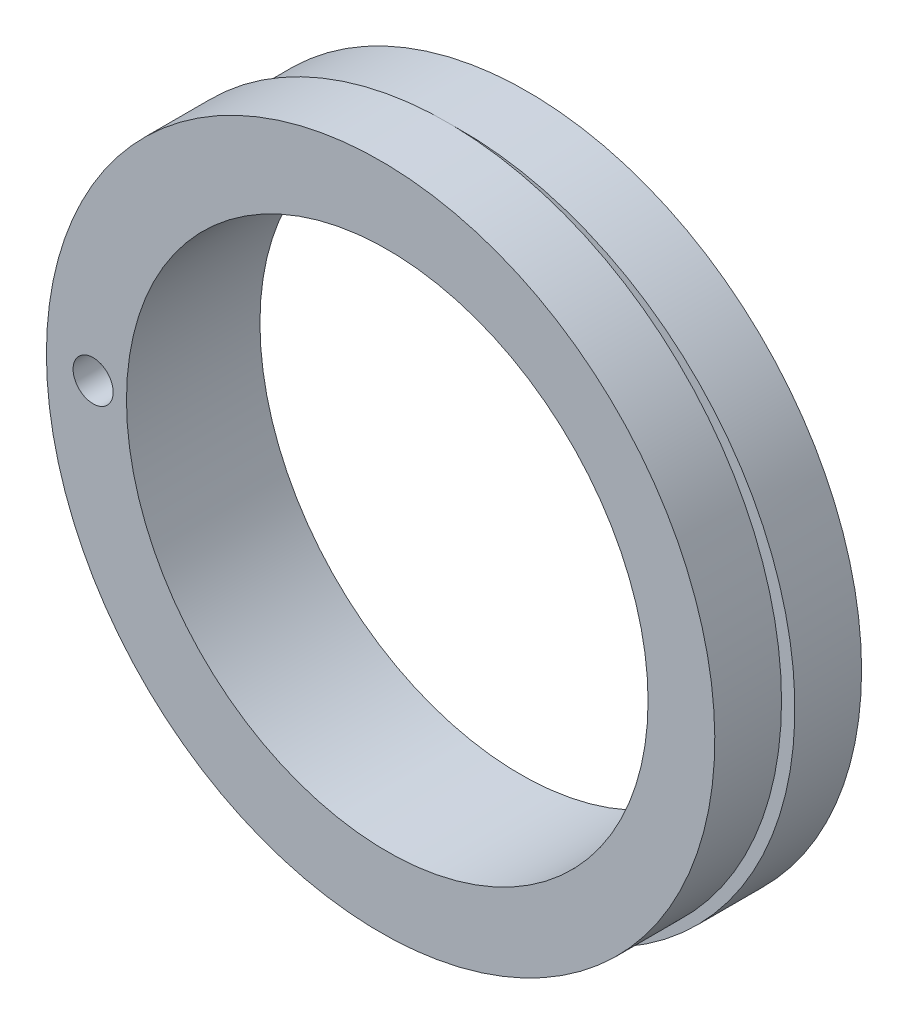
ISO-10303-21;
HEADER;
FILE_DESCRIPTION(('STEP AP214'),'2;1');
FILE_NAME('part.step','',(''),(''),'','','');
FILE_SCHEMA(('AUTOMOTIVE_DESIGN { 1 0 10303 214 1 1 1 1 }'));
ENDSEC;
DATA;
#1=APPLICATION_CONTEXT('core data for automotive mechanical design processes');
#2=APPLICATION_PROTOCOL_DEFINITION('international standard','automotive_design',2000,#1);
#3=PRODUCT_CONTEXT('',#1,'mechanical');
#4=PRODUCT('Part','Part','',(#3));
#5=PRODUCT_RELATED_PRODUCT_CATEGORY('part','',(#4));
#6=PRODUCT_DEFINITION_FORMATION('','',#4);
#7=PRODUCT_DEFINITION_CONTEXT('part definition',#1,'design');
#8=PRODUCT_DEFINITION('design','',#6,#7);
#9=PRODUCT_DEFINITION_SHAPE('','',#8);
#10=(LENGTH_UNIT() NAMED_UNIT(*) SI_UNIT(.MILLI.,.METRE.));
#11=(NAMED_UNIT(*) PLANE_ANGLE_UNIT() SI_UNIT($,.RADIAN.));
#12=(NAMED_UNIT(*) SI_UNIT($,.STERADIAN.) SOLID_ANGLE_UNIT());
#13=UNCERTAINTY_MEASURE_WITH_UNIT(LENGTH_MEASURE(1.E-05),#10,'distance_accuracy_value','');
#14=(GEOMETRIC_REPRESENTATION_CONTEXT(3) GLOBAL_UNCERTAINTY_ASSIGNED_CONTEXT((#13)) GLOBAL_UNIT_ASSIGNED_CONTEXT((#10,
#11,#12)) REPRESENTATION_CONTEXT('',''));
#15=CARTESIAN_POINT('',(0.,0.,0.));
#16=DIRECTION('',(0.,0.,1.));
#17=DIRECTION('',(1.,0.,0.));
#18=AXIS2_PLACEMENT_3D('',#15,#16,#17);
#19=CARTESIAN_POINT('',(0.5,0.,5.));
#20=DIRECTION('',(0.,0.,1.));
#21=DIRECTION('',(1.,0.,0.));
#22=AXIS2_PLACEMENT_3D('',#19,#20,#21);
#23=PLANE('',#22);
#24=CARTESIAN_POINT('',(-0.5,0.,5.));
#25=DIRECTION('',(0.,0.,1.));
#26=DIRECTION('',(-1.,0.,0.));
#27=AXIS2_PLACEMENT_3D('',#24,#25,#26);
#28=CIRCLE('',#27,25.043);
#29=CARTESIAN_POINT('',(0.,-25.0380080877054,5.));
#30=VERTEX_POINT('',#29);
#31=CARTESIAN_POINT('',(0.,25.0380080877054,5.));
#32=VERTEX_POINT('',#31);
#33=EDGE_CURVE('E53',#30,#32,#28,.T.);
#34=ORIENTED_EDGE('',*,*,#33,.F.);
#35=CARTESIAN_POINT('',(0.5,0.,5.));
#36=DIRECTION('',(0.,0.,1.));
#37=DIRECTION('',(1.,0.,0.));
#38=AXIS2_PLACEMENT_3D('',#35,#36,#37);
#39=CIRCLE('',#38,25.043);
#40=EDGE_CURVE('E47',#30,#32,#39,.T.);
#41=ORIENTED_EDGE('',*,*,#40,.T.);
#42=EDGE_LOOP('',(#34,#41));
#43=FACE_BOUND('',#42,.T.);
#44=ADVANCED_FACE('F38',(#43),#23,.T.);
#45=CARTESIAN_POINT('',(0.5,0.,0.));
#46=DIRECTION('',(0.,0.,1.));
#47=DIRECTION('',(1.,0.,0.));
#48=AXIS2_PLACEMENT_3D('',#45,#46,#47);
#49=PLANE('',#48);
#50=CARTESIAN_POINT('',(0.5,0.,0.));
#51=DIRECTION('',(0.,0.,1.));
#52=DIRECTION('',(1.,0.,0.));
#53=AXIS2_PLACEMENT_3D('',#50,#51,#52);
#54=CIRCLE('',#53,25.043);
#55=CARTESIAN_POINT('',(25.543,0.,0.));
#56=VERTEX_POINT('',#55);
#57=EDGE_CURVE('E42',#56,#56,#54,.T.);
#58=ORIENTED_EDGE('',*,*,#57,.F.);
#59=EDGE_LOOP('',(#58));
#60=FACE_BOUND('',#59,.T.);
#61=CARTESIAN_POINT('',(0.,0.,0.));
#62=DIRECTION('',(0.,0.,1.));
#63=DIRECTION('',(1.,0.,0.));
#64=AXIS2_PLACEMENT_3D('',#61,#62,#63);
#65=CIRCLE('',#64,19.543);
#66=CARTESIAN_POINT('',(19.543,0.,0.));
#67=VERTEX_POINT('',#66);
#68=EDGE_CURVE('E78',#67,#67,#65,.T.);
#69=ORIENTED_EDGE('',*,*,#68,.T.);
#70=EDGE_LOOP('',(#69));
#71=FACE_BOUND('',#70,.T.);
#72=CARTESIAN_POINT('',(22.043,0.,0.));
#73=DIRECTION('',(0.,0.,1.));
#74=DIRECTION('',(1.,0.,0.));
#75=AXIS2_PLACEMENT_3D('',#72,#73,#74);
#76=CIRCLE('',#75,1.5);
#77=CARTESIAN_POINT('',(23.543,0.,0.));
#78=VERTEX_POINT('',#77);
#79=EDGE_CURVE('E75',#78,#78,#76,.T.);
#80=ORIENTED_EDGE('',*,*,#79,.T.);
#81=EDGE_LOOP('',(#80));
#82=FACE_BOUND('',#81,.T.);
#83=ADVANCED_FACE('F85',(#60,#71,#82),#49,.F.);
#84=CARTESIAN_POINT('',(0.5,0.,5.));
#85=DIRECTION('',(0.,0.,-1.));
#86=DIRECTION('',(-1.,0.,0.));
#87=AXIS2_PLACEMENT_3D('',#84,#85,#86);
#88=CYLINDRICAL_SURFACE('',#87,25.043);
#89=EDGE_CURVE('E11',#32,#30,#39,.T.);
#90=ORIENTED_EDGE('',*,*,#89,.F.);
#91=ORIENTED_EDGE('',*,*,#40,.F.);
#92=EDGE_LOOP('',(#90,#91));
#93=FACE_BOUND('',#92,.T.);
#94=ORIENTED_EDGE('',*,*,#57,.T.);
#95=EDGE_LOOP('',(#94));
#96=FACE_BOUND('',#95,.T.);
#97=ADVANCED_FACE('F40',(#93,#96),#88,.T.);
#98=CARTESIAN_POINT('',(0.,0.,5.));
#99=DIRECTION('',(0.,0.,-1.));
#100=DIRECTION('',(-1.,0.,0.));
#101=AXIS2_PLACEMENT_3D('',#98,#99,#100);
#102=CYLINDRICAL_SURFACE('',#101,19.543);
#103=ORIENTED_EDGE('',*,*,#68,.F.);
#104=EDGE_LOOP('',(#103));
#105=FACE_BOUND('',#104,.T.);
#106=CARTESIAN_POINT('',(0.,0.,10.));
#107=DIRECTION('',(0.,0.,1.));
#108=DIRECTION('',(-1.,0.,0.));
#109=AXIS2_PLACEMENT_3D('',#106,#107,#108);
#110=CIRCLE('',#109,19.543);
#111=CARTESIAN_POINT('',(-19.543,-1.36468039610023E-13,10.));
#112=VERTEX_POINT('',#111);
#113=EDGE_CURVE('E64',#112,#112,#110,.T.);
#114=ORIENTED_EDGE('',*,*,#113,.T.);
#115=EDGE_LOOP('',(#114));
#116=FACE_BOUND('',#115,.T.);
#117=ADVANCED_FACE('F93',(#105,#116),#102,.F.);
#118=CARTESIAN_POINT('',(22.043,0.,5.));
#119=DIRECTION('',(0.,0.,-1.));
#120=DIRECTION('',(-1.,0.,0.));
#121=AXIS2_PLACEMENT_3D('',#118,#119,#120);
#122=CYLINDRICAL_SURFACE('',#121,1.5);
#123=CARTESIAN_POINT('',(22.043,0.,5.));
#124=DIRECTION('',(0.,0.,1.));
#125=DIRECTION('',(1.,0.,0.));
#126=AXIS2_PLACEMENT_3D('',#123,#124,#125);
#127=CIRCLE('',#126,1.5);
#128=CARTESIAN_POINT('',(23.543,0.,5.));
#129=VERTEX_POINT('',#128);
#130=EDGE_CURVE('E69',#129,#129,#127,.T.);
#131=ORIENTED_EDGE('',*,*,#130,.T.);
#132=EDGE_LOOP('',(#131));
#133=FACE_BOUND('',#132,.T.);
#134=ORIENTED_EDGE('',*,*,#79,.F.);
#135=EDGE_LOOP('',(#134));
#136=FACE_BOUND('',#135,.T.);
#137=ADVANCED_FACE('F90',(#133,#136),#122,.F.);
#138=CARTESIAN_POINT('',(-22.043,-1.53925446304238E-13,10.));
#139=DIRECTION('',(0.,0.,-1.));
#140=DIRECTION('',(1.,0.,0.));
#141=AXIS2_PLACEMENT_3D('',#138,#139,#140);
#142=CYLINDRICAL_SURFACE('',#141,1.5);
#143=CARTESIAN_POINT('',(-22.043,-1.53925446304238E-13,10.));
#144=DIRECTION('',(0.,0.,1.));
#145=DIRECTION('',(-1.,0.,0.));
#146=AXIS2_PLACEMENT_3D('',#143,#144,#145);
#147=CIRCLE('',#146,1.5);
#148=CARTESIAN_POINT('',(-23.543,-1.64399890320768E-13,10.));
#149=VERTEX_POINT('',#148);
#150=EDGE_CURVE('E124',#149,#149,#147,.T.);
#151=ORIENTED_EDGE('',*,*,#150,.T.);
#152=EDGE_LOOP('',(#151));
#153=FACE_BOUND('',#152,.T.);
#154=CARTESIAN_POINT('',(-22.043,-1.53925446304238E-13,5.));
#155=DIRECTION('',(0.,0.,1.));
#156=DIRECTION('',(-1.,0.,0.));
#157=AXIS2_PLACEMENT_3D('',#154,#155,#156);
#158=CIRCLE('',#157,1.5);
#159=CARTESIAN_POINT('',(-23.543,-1.64399890320768E-13,5.));
#160=VERTEX_POINT('',#159);
#161=EDGE_CURVE('E122',#160,#160,#158,.T.);
#162=ORIENTED_EDGE('',*,*,#161,.F.);
#163=EDGE_LOOP('',(#162));
#164=FACE_BOUND('',#163,.T.);
#165=ADVANCED_FACE('F92',(#153,#164),#142,.F.);
#166=CARTESIAN_POINT('',(-0.5,0.,10.));
#167=DIRECTION('',(0.,0.,-1.));
#168=DIRECTION('',(1.,0.,0.));
#169=AXIS2_PLACEMENT_3D('',#166,#167,#168);
#170=CYLINDRICAL_SURFACE('',#169,25.043);
#171=CARTESIAN_POINT('',(-0.5,0.,10.));
#172=DIRECTION('',(0.,0.,1.));
#173=DIRECTION('',(-1.,0.,0.));
#174=AXIS2_PLACEMENT_3D('',#171,#172,#173);
#175=CIRCLE('',#174,25.043);
#176=CARTESIAN_POINT('',(-25.543,-1.7836581567614E-13,10.));
#177=VERTEX_POINT('',#176);
#178=EDGE_CURVE('E67',#177,#177,#175,.T.);
#179=ORIENTED_EDGE('',*,*,#178,.F.);
#180=EDGE_LOOP('',(#179));
#181=FACE_BOUND('',#180,.T.);
#182=ORIENTED_EDGE('',*,*,#33,.T.);
#183=EDGE_CURVE('E61',#32,#30,#28,.T.);
#184=ORIENTED_EDGE('',*,*,#183,.T.);
#185=EDGE_LOOP('',(#182,#184));
#186=FACE_BOUND('',#185,.T.);
#187=ADVANCED_FACE('F66',(#181,#186),#170,.T.);
#188=CARTESIAN_POINT('',(-0.5,0.,10.));
#189=DIRECTION('',(0.,0.,1.));
#190=DIRECTION('',(-1.,0.,0.));
#191=AXIS2_PLACEMENT_3D('',#188,#189,#190);
#192=PLANE('',#191);
#193=ORIENTED_EDGE('',*,*,#113,.F.);
#194=EDGE_LOOP('',(#193));
#195=FACE_BOUND('',#194,.T.);
#196=ORIENTED_EDGE('',*,*,#178,.T.);
#197=EDGE_LOOP('',(#196));
#198=FACE_BOUND('',#197,.T.);
#199=ORIENTED_EDGE('',*,*,#150,.F.);
#200=EDGE_LOOP('',(#199));
#201=FACE_BOUND('',#200,.T.);
#202=ADVANCED_FACE('F132',(#195,#198,#201),#192,.T.);
#203=CARTESIAN_POINT('',(-0.5,0.,5.));
#204=DIRECTION('',(0.,0.,1.));
#205=DIRECTION('',(-1.,0.,0.));
#206=AXIS2_PLACEMENT_3D('',#203,#204,#205);
#207=PLANE('',#206);
#208=ORIENTED_EDGE('',*,*,#183,.F.);
#209=ORIENTED_EDGE('',*,*,#89,.T.);
#210=EDGE_LOOP('',(#208,#209));
#211=FACE_BOUND('',#210,.T.);
#212=ADVANCED_FACE('F62',(#211),#207,.F.);
#213=ORIENTED_EDGE('',*,*,#130,.F.);
#214=EDGE_LOOP('',(#213));
#215=FACE_BOUND('',#214,.T.);
#216=ADVANCED_FACE('F114',(#215),#207,.F.);
#217=ORIENTED_EDGE('',*,*,#161,.T.);
#218=EDGE_LOOP('',(#217));
#219=FACE_BOUND('',#218,.T.);
#220=ADVANCED_FACE('F110',(#219),#23,.T.);
#221=CLOSED_SHELL('',(#44,#83,#97,#117,#137,#165,#187,#202,#212,#216,#220));
#222=MANIFOLD_SOLID_BREP('B2',#221);
#223=ADVANCED_BREP_SHAPE_REPRESENTATION('',(#18,#222),#14);
#224=SHAPE_DEFINITION_REPRESENTATION(#9,#223);
ENDSEC;
END-ISO-10303-21;
